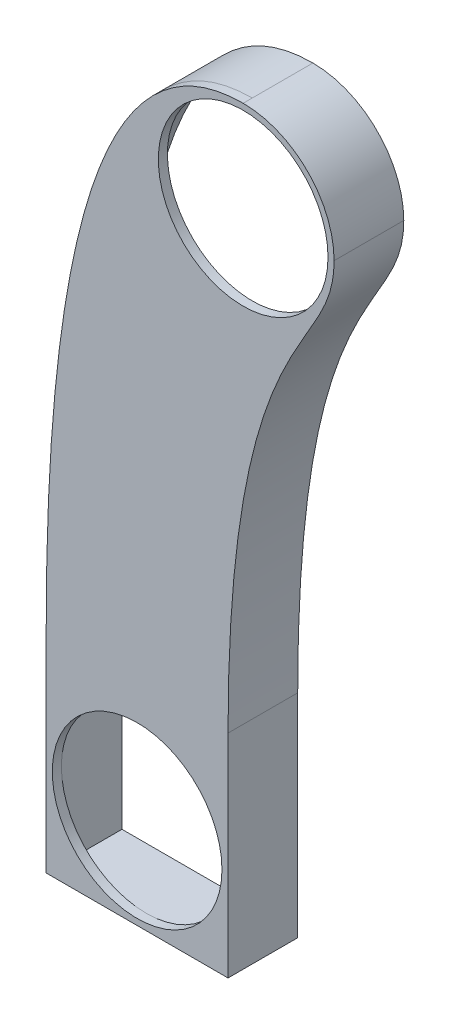
ISO-10303-21;
HEADER;
FILE_DESCRIPTION(('STEP AP214'),'2;1');
FILE_NAME('part.step','',(''),(''),'','','');
FILE_SCHEMA(('AUTOMOTIVE_DESIGN { 1 0 10303 214 1 1 1 1 }'));
ENDSEC;
DATA;
#1=APPLICATION_CONTEXT('core data for automotive mechanical design processes');
#2=APPLICATION_PROTOCOL_DEFINITION('international standard','automotive_design',2000,#1);
#3=PRODUCT_CONTEXT('',#1,'mechanical');
#4=PRODUCT('Part','Part','',(#3));
#5=PRODUCT_RELATED_PRODUCT_CATEGORY('part','',(#4));
#6=PRODUCT_DEFINITION_FORMATION('','',#4);
#7=PRODUCT_DEFINITION_CONTEXT('part definition',#1,'design');
#8=PRODUCT_DEFINITION('design','',#6,#7);
#9=PRODUCT_DEFINITION_SHAPE('','',#8);
#10=(LENGTH_UNIT() NAMED_UNIT(*) SI_UNIT(.MILLI.,.METRE.));
#11=(NAMED_UNIT(*) PLANE_ANGLE_UNIT() SI_UNIT($,.RADIAN.));
#12=(NAMED_UNIT(*) SI_UNIT($,.STERADIAN.) SOLID_ANGLE_UNIT());
#13=UNCERTAINTY_MEASURE_WITH_UNIT(LENGTH_MEASURE(1.E-05),#10,'distance_accuracy_value','');
#14=(GEOMETRIC_REPRESENTATION_CONTEXT(3) GLOBAL_UNCERTAINTY_ASSIGNED_CONTEXT((#13)) GLOBAL_UNIT_ASSIGNED_CONTEXT((#10,
#11,#12)) REPRESENTATION_CONTEXT('',''));
#15=CARTESIAN_POINT('',(0.,0.,0.));
#16=DIRECTION('',(0.,0.,1.));
#17=DIRECTION('',(1.,0.,0.));
#18=AXIS2_PLACEMENT_3D('',#15,#16,#17);
#19=CARTESIAN_POINT('',(0.,0.,0.));
#20=DIRECTION('',(0.,0.,1.));
#21=DIRECTION('',(1.,0.,0.));
#22=AXIS2_PLACEMENT_3D('',#19,#20,#21);
#23=PLANE('',#22);
#24=DIRECTION('',(-9.3542412378089E-13,1.,0.));
#25=VECTOR('',#24,1.);
#26=CARTESIAN_POINT('',(-28.,-68.,0.));
#27=LINE('',#26,#25);
#28=CARTESIAN_POINT('',(-28.0000000000262,-40.0000000000262,0.));
#29=VERTEX_POINT('',#28);
#30=CARTESIAN_POINT('',(-28.0000000000636,1.82354131794682E-11,0.));
#31=VERTEX_POINT('',#30);
#32=EDGE_CURVE('E11',#29,#31,#27,.T.);
#33=ORIENTED_EDGE('',*,*,#32,.T.);
#34=CARTESIAN_POINT('',(-28.0000000000636,1.82312256816691E-11,0.));
#35=CARTESIAN_POINT('',(-28.0000000000632,1.88242830589258,0.));
#36=CARTESIAN_POINT('',(-27.9894412004573,5.66891466084527,0.));
#37=CARTESIAN_POINT('',(-27.9260965546054,13.0686717703561,0.));
#38=CARTESIAN_POINT('',(-27.7677563903192,22.1131384556277,0.));
#39=CARTESIAN_POINT('',(-27.4511536703674,32.6004727744265,0.));
#40=CARTESIAN_POINT('',(-26.8603239944832,46.1086580240732,0.));
#41=CARTESIAN_POINT('',(-25.8056980342325,62.0968296216774,0.));
#42=CARTESIAN_POINT('',(-24.0353498943405,79.8475773779823,0.));
#43=CARTESIAN_POINT('',(-21.7615874898928,96.1606385496096,0.));
#44=CARTESIAN_POINT('',(-18.06159529243,115.99115876177,0.));
#45=CARTESIAN_POINT('',(-12.1907333738252,137.171036702095,0.));
#46=CARTESIAN_POINT('',(-3.19689664453314,156.784444581929,0.));
#47=CARTESIAN_POINT('',(5.83466156629296,168.281935436508,0.));
#48=CARTESIAN_POINT('',(13.9243973629886,174.636152769235,0.));
#49=CARTESIAN_POINT('',(19.3469360095935,177.454327422876,0.));
#50=CARTESIAN_POINT('',(23.9211292025,179.031545110437,0.));
#51=CARTESIAN_POINT('',(27.4748196463747,179.877405656582,0.));
#52=CARTESIAN_POINT('',(30.5465032109327,180.30151599736,0.));
#53=CARTESIAN_POINT('',(33.0654690458934,180.471580894841,0.));
#54=CARTESIAN_POINT('',(34.3577311572569,180.499999999884,0.));
#55=CARTESIAN_POINT('',(35.0000000000017,180.499999999884,0.));
#56=B_SPLINE_CURVE_WITH_KNOTS('',3,(#34,#35,#36,#37,#38,#39,#40,#41,#42,#43,#44,#45,#46,#47,#48,
#49,#50,#51,#52,#53,#54,#55),.UNSPECIFIED.,.F.,.F.,(4,1,1,1,1,1,1,1,1,1,1,1,1,1,1,1,1,1,1,4),
(0.493824089835039,0.49393282957438,0.49404156931372,0.494259048792402,0.494476528271083,
0.494694007749765,0.495128966707128,0.495563925664491,0.495998884621854,0.496433843579217,
0.497303761493944,0.49817367940867,0.499043597323396,0.499478556280759,0.499913515238122,
0.500130994716804,0.500348474195485,0.500565953674167,0.500674693413508,0.500783433152848),.UNSPECIFIED.);
#57=CARTESIAN_POINT('',(35.0000000000017,180.499999999942,0.));
#58=VERTEX_POINT('',#57);
#59=EDGE_CURVE('E293',#31,#58,#56,.T.);
#60=ORIENTED_EDGE('',*,*,#59,.T.);
#61=CARTESIAN_POINT('',(35.,152.5,0.));
#62=DIRECTION('',(0.,0.,1.));
#63=DIRECTION('',(1.,0.,0.));
#64=AXIS2_PLACEMENT_3D('',#61,#62,#63);
#65=CIRCLE('',#64,28.);
#66=CARTESIAN_POINT('',(62.9999999999418,152.5,0.));
#67=VERTEX_POINT('',#66);
#68=EDGE_CURVE('E166',#58,#67,#65,.T.);
#69=ORIENTED_EDGE('',*,*,#68,.T.);
#70=CARTESIAN_POINT('',(63.,152.5,0.));
#71=CARTESIAN_POINT('',(63.,152.069757812165,0.));
#72=CARTESIAN_POINT('',(62.9838250449428,151.199286284567,0.));
#73=CARTESIAN_POINT('',(62.8891848797862,149.54001987776,0.));
#74=CARTESIAN_POINT('',(62.65845259311,147.549741818048,0.));
#75=CARTESIAN_POINT('',(62.2138862986821,145.278400199613,0.));
#76=CARTESIAN_POINT('',(61.4108121463035,142.352354087116,0.));
#77=CARTESIAN_POINT('',(60.0332105680831,138.803653619855,0.));
#78=CARTESIAN_POINT('',(57.8462227018474,134.475175878977,0.));
#79=CARTESIAN_POINT('',(55.2089761951799,129.863823007502,0.));
#80=CARTESIAN_POINT('',(51.2314520335892,123.063969132701,0.));
#81=CARTESIAN_POINT('',(46.7924569058603,114.875371888974,0.));
#82=CARTESIAN_POINT('',(42.352360132025,104.461715313234,0.));
#83=CARTESIAN_POINT('',(39.1306324652729,95.3264090451642,0.));
#84=CARTESIAN_POINT('',(36.1230205341335,84.6512503590278,0.));
#85=CARTESIAN_POINT('',(33.4323495842207,72.2183690237835,0.));
#86=CARTESIAN_POINT('',(31.538773259296,60.2092444213663,0.));
#87=CARTESIAN_POINT('',(30.2835598019819,49.5017884718432,0.));
#88=CARTESIAN_POINT('',(29.484585221264,40.8932270784835,0.));
#89=CARTESIAN_POINT('',(28.8406681991326,31.6786860607649,0.));
#90=CARTESIAN_POINT('',(28.4438156030236,23.4718104333185,0.));
#91=CARTESIAN_POINT('',(28.2165076779976,16.5749660647671,0.));
#92=CARTESIAN_POINT('',(28.092697498186,11.2343839804093,0.));
#93=CARTESIAN_POINT('',(28.0297350777991,6.63685717797195,0.));
#94=CARTESIAN_POINT('',(28.0042856546149,2.8782378858248,0.));
#95=CARTESIAN_POINT('',(28.,0.95582289376821,0.));
#96=CARTESIAN_POINT('',(28.,0.,0.));
#97=B_SPLINE_CURVE_WITH_KNOTS('',3,(#70,#71,#72,#73,#74,#75,#76,#77,#78,#79,#80,#81,#82,#83,#84,
#85,#86,#87,#88,#89,#90,#91,#92,#93,#94,#95,#96),.UNSPECIFIED.,.F.,.F.,(4,1,1,1,1,1,1,1,1,1,1,1,
1,1,1,1,1,1,1,1,1,1,1,1,4),(0.,0.015625,0.03125,0.0625,0.09375,0.125,0.1875,0.25,0.3125,0.375,
0.5,0.5625,0.625,0.6875,0.75,0.8125,0.84375,0.875,0.90625,0.9375,0.953125,0.96875,0.984375,
0.9921875,1.),.UNSPECIFIED.);
#98=CARTESIAN_POINT('',(28.,0.,0.));
#99=VERTEX_POINT('',#98);
#100=EDGE_CURVE('E355',#67,#99,#97,.T.);
#101=ORIENTED_EDGE('',*,*,#100,.T.);
#102=DIRECTION('',(0.,-1.,0.));
#103=VECTOR('',#102,1.);
#104=CARTESIAN_POINT('',(28.,0.,0.));
#105=LINE('',#104,#103);
#106=CARTESIAN_POINT('',(28.,-40.,0.));
#107=VERTEX_POINT('',#106);
#108=EDGE_CURVE('E350',#99,#107,#105,.T.);
#109=ORIENTED_EDGE('',*,*,#108,.T.);
#110=CARTESIAN_POINT('',(0.,-40.,0.));
#111=DIRECTION('',(0.,0.,1.));
#112=DIRECTION('',(1.,0.,0.));
#113=AXIS2_PLACEMENT_3D('',#110,#111,#112);
#114=CIRCLE('',#113,28.);
#115=EDGE_CURVE('E296',#107,#29,#114,.T.);
#116=ORIENTED_EDGE('',*,*,#115,.T.);
#117=EDGE_LOOP('',(#33,#60,#69,#101,#109,#116));
#118=FACE_BOUND('',#117,.T.);
#119=ADVANCED_FACE('F41',(#118),#23,.F.);
#120=DIRECTION('',(-1.,0.,0.));
#121=VECTOR('',#120,1.);
#122=CARTESIAN_POINT('',(28.,-68.,0.));
#123=LINE('',#122,#121);
#124=CARTESIAN_POINT('',(0.,-68.,0.));
#125=VERTEX_POINT('',#124);
#126=CARTESIAN_POINT('',(-28.,-68.,0.));
#127=VERTEX_POINT('',#126);
#128=EDGE_CURVE('E302',#125,#127,#123,.T.);
#129=ORIENTED_EDGE('',*,*,#128,.T.);
#130=EDGE_CURVE('E53',#127,#29,#27,.T.);
#131=ORIENTED_EDGE('',*,*,#130,.T.);
#132=EDGE_CURVE('E301',#29,#125,#114,.T.);
#133=ORIENTED_EDGE('',*,*,#132,.T.);
#134=EDGE_LOOP('',(#129,#131,#133));
#135=FACE_BOUND('',#134,.T.);
#136=ADVANCED_FACE('F279',(#135),#23,.F.);
#137=CARTESIAN_POINT('',(30.,0.,3.));
#138=DIRECTION('',(-1.,0.,0.));
#139=DIRECTION('',(0.,0.,1.));
#140=AXIS2_PLACEMENT_3D('',#137,#138,#139);
#141=PLANE('',#140);
#142=DIRECTION('',(0.,0.,-1.));
#143=VECTOR('',#142,1.);
#144=CARTESIAN_POINT('',(30.,-70.,3.));
#145=LINE('',#144,#143);
#146=CARTESIAN_POINT('',(30.,-70.,3.));
#147=VERTEX_POINT('',#146);
#148=CARTESIAN_POINT('',(30.,-70.,-20.));
#149=VERTEX_POINT('',#148);
#150=EDGE_CURVE('E321',#147,#149,#145,.T.);
#151=ORIENTED_EDGE('',*,*,#150,.T.);
#152=DIRECTION('',(0.,-1.,0.));
#153=VECTOR('',#152,1.);
#154=CARTESIAN_POINT('',(30.,0.,-20.));
#155=LINE('',#154,#153);
#156=CARTESIAN_POINT('',(30.,0.,-20.));
#157=VERTEX_POINT('',#156);
#158=EDGE_CURVE('E220',#157,#149,#155,.T.);
#159=ORIENTED_EDGE('',*,*,#158,.F.);
#160=DIRECTION('',(0.,0.,-1.));
#161=VECTOR('',#160,1.);
#162=CARTESIAN_POINT('',(30.,0.,3.));
#163=LINE('',#162,#161);
#164=CARTESIAN_POINT('',(30.,0.,3.));
#165=VERTEX_POINT('',#164);
#166=EDGE_CURVE('E45',#165,#157,#163,.T.);
#167=ORIENTED_EDGE('',*,*,#166,.F.);
#168=DIRECTION('',(0.,1.,0.));
#169=VECTOR('',#168,1.);
#170=CARTESIAN_POINT('',(30.,0.,3.));
#171=LINE('',#170,#169);
#172=EDGE_CURVE('E244',#147,#165,#171,.T.);
#173=ORIENTED_EDGE('',*,*,#172,.F.);
#174=EDGE_LOOP('',(#151,#159,#167,#173));
#175=FACE_BOUND('',#174,.T.);
#176=ADVANCED_FACE('F233',(#175),#141,.F.);
#177=CARTESIAN_POINT('',(30.,0.,3.));
#178=CARTESIAN_POINT('',(30.,122.919601084502,3.));
#179=CARTESIAN_POINT('',(65.,122.919601084502,3.));
#180=CARTESIAN_POINT('',(65.,152.5,3.));
#181=B_SPLINE_CURVE_WITH_KNOTS('',3,(#177,#178,#179,#180),.UNSPECIFIED.,.F.,.F.,(4,4),(0.,1.),.UNSPECIFIED.);
#182=DIRECTION('',(0.,0.,-1.));
#183=VECTOR('',#182,1.);
#184=SURFACE_OF_LINEAR_EXTRUSION('',#181,#183);
#185=ORIENTED_EDGE('',*,*,#166,.T.);
#186=CARTESIAN_POINT('',(65.,152.499999282763,-20.));
#187=CARTESIAN_POINT('',(65.0000225093433,152.079571540982,-20.));
#188=CARTESIAN_POINT('',(64.9929314754865,151.659116795042,-20.));
#189=CARTESIAN_POINT('',(64.9638737544473,150.819083773418,-20.));
#190=CARTESIAN_POINT('',(64.9419197255293,150.399505056417,-20.));
#191=CARTESIAN_POINT('',(64.8825127436622,149.561762039167,-20.));
#192=CARTESIAN_POINT('',(64.8450718115272,149.143596894952,-20.));
#193=CARTESIAN_POINT('',(64.7542697192073,148.30922507543,-20.));
#194=CARTESIAN_POINT('',(64.700917243483,147.893017457263,-20.));
#195=CARTESIAN_POINT('',(64.5780655360384,147.063081092378,-20.));
#196=CARTESIAN_POINT('',(64.50856982526,146.649351825273,-20.));
#197=CARTESIAN_POINT('',(64.3558967379244,145.837893642723,-20.));
#198=CARTESIAN_POINT('',(64.2732183706114,145.440070727142,-20.));
#199=CARTESIAN_POINT('',(64.0930145742882,144.647794070053,-20.));
#200=CARTESIAN_POINT('',(63.9954887672314,144.253340414604,-20.));
#201=CARTESIAN_POINT('',(63.7861032242475,143.468216072196,-20.));
#202=CARTESIAN_POINT('',(63.6742418983351,143.077545810039,-20.));
#203=CARTESIAN_POINT('',(63.4369336598666,142.300331776913,-20.));
#204=CARTESIAN_POINT('',(63.3114857940528,141.91378829758,-20.));
#205=CARTESIAN_POINT('',(63.0479738390948,141.145111676085,-20.));
#206=CARTESIAN_POINT('',(62.9099118624578,140.762977807466,-20.));
#207=CARTESIAN_POINT('',(62.586961271828,139.909936343195,-20.));
#208=CARTESIAN_POINT('',(62.3988908678292,139.440233624961,-20.));
#209=CARTESIAN_POINT('',(62.0071174863187,138.507437216813,-20.));
#210=CARTESIAN_POINT('',(61.8034147444672,138.044343427393,-20.));
#211=CARTESIAN_POINT('',(61.3827111960998,137.124194165594,-20.));
#212=CARTESIAN_POINT('',(61.1657088330288,136.667139407647,-20.));
#213=CARTESIAN_POINT('',(60.7207866089472,135.758484874742,-20.));
#214=CARTESIAN_POINT('',(60.4928684450266,135.306884265405,-20.));
#215=CARTESIAN_POINT('',(60.0261554126538,134.404106291875,-20.));
#216=CARTESIAN_POINT('',(59.7872800341304,133.952970700409,-20.));
#217=CARTESIAN_POINT('',(59.3027463187309,133.054481129822,-20.));
#218=CARTESIAN_POINT('',(59.0570892886997,132.607126443514,-20.));
#219=CARTESIAN_POINT('',(58.5607831980561,131.715113596393,-20.));
#220=CARTESIAN_POINT('',(58.3101333794672,131.27045585859,-20.));
#221=CARTESIAN_POINT('',(57.8054433133086,130.382858107568,-20.));
#222=CARTESIAN_POINT('',(57.5514018575572,129.939918783149,-20.));
#223=CARTESIAN_POINT('',(56.9554274844714,128.905778521757,-20.));
#224=CARTESIAN_POINT('',(56.612769992388,128.31499624511,-20.));
#225=CARTESIAN_POINT('',(55.927124577463,127.133620849294,-20.));
#226=CARTESIAN_POINT('',(55.5841366529613,126.543027731093,-20.));
#227=CARTESIAN_POINT('',(54.9001055554189,125.360430308046,-20.));
#228=CARTESIAN_POINT('',(54.5590631231961,124.7684255734,-20.));
#229=CARTESIAN_POINT('',(53.8809830068435,123.582124796041,-20.));
#230=CARTESIAN_POINT('',(53.5439453081311,122.987828761683,-20.));
#231=CARTESIAN_POINT('',(52.8755640180871,121.796399641421,-20.));
#232=CARTESIAN_POINT('',(52.5442178622454,121.199267996715,-20.));
#233=CARTESIAN_POINT('',(51.888259389072,120.001312317796,-20.));
#234=CARTESIAN_POINT('',(51.5636470740787,119.4004882823,-20.));
#235=CARTESIAN_POINT('',(50.9222983619453,118.195180739976,-20.));
#236=CARTESIAN_POINT('',(50.605556668198,117.590700054375,-20.));
#237=CARTESIAN_POINT('',(49.9804016616337,116.377444716498,-20.));
#238=CARTESIAN_POINT('',(49.671988349109,115.768670064073,-20.));
#239=CARTESIAN_POINT('',(49.0641422232935,114.547047382416,-20.));
#240=CARTESIAN_POINT('',(48.764704794547,113.934201651718,-20.));
#241=CARTESIAN_POINT('',(48.1749700480183,112.704126330879,-20.));
#242=CARTESIAN_POINT('',(47.8846728183301,112.086896698556,-20.));
#243=CARTESIAN_POINT('',(47.0279333854737,110.228962383492,-20.));
#244=CARTESIAN_POINT('',(46.4755142464176,108.98175301984,-20.));
#245=CARTESIAN_POINT('',(45.4113570677909,106.477790994225,-20.));
#246=CARTESIAN_POINT('',(44.8994222950001,105.221121765054,-20.));
#247=CARTESIAN_POINT('',(43.9118828427142,102.692179971328,-20.));
#248=CARTESIAN_POINT('',(43.436314232688,101.419893331449,-20.));
#249=CARTESIAN_POINT('',(42.5203487146474,98.8614883195292,-20.));
#250=CARTESIAN_POINT('',(42.0799829087202,97.5753588308279,-20.));
#251=CARTESIAN_POINT('',(41.2329127133748,94.9911405071065,-20.));
#252=CARTESIAN_POINT('',(40.8262307880103,93.6930443224692,-20.));
#253=CARTESIAN_POINT('',(40.0448544878124,91.0868124590694,-20.));
#254=CARTESIAN_POINT('',(39.670170630771,89.7786736321002,-20.));
#255=CARTESIAN_POINT('',(38.951070885791,87.1543118015461,-20.));
#256=CARTESIAN_POINT('',(38.6066511686576,85.8380898432978,-20.));
#257=CARTESIAN_POINT('',(37.7068090980276,82.2423068024699,-20.));
#258=CARTESIAN_POINT('',(37.1793111552935,79.9557239527925,-20.));
#259=CARTESIAN_POINT('',(36.1996410903517,75.3680977313031,-20.));
#260=CARTESIAN_POINT('',(35.7474234211959,73.0670639837941,-20.));
#261=CARTESIAN_POINT('',(34.9097166972455,68.4528629982201,-20.));
#262=CARTESIAN_POINT('',(34.5242299310801,66.1396953468081,-20.));
#263=CARTESIAN_POINT('',(33.8127172013442,61.5034512485222,-20.));
#264=CARTESIAN_POINT('',(33.4867125527975,59.1803715537141,-20.));
#265=CARTESIAN_POINT('',(32.8879777870148,54.5263382714896,-20.));
#266=CARTESIAN_POINT('',(32.6152717251679,52.1953816095359,-20.));
#267=CARTESIAN_POINT('',(32.1178396165017,47.527503502892,-20.));
#268=CARTESIAN_POINT('',(31.8931316604186,45.1905801439625,-20.));
#269=CARTESIAN_POINT('',(31.4836763972852,40.4728081050565,-20.));
#270=CARTESIAN_POINT('',(31.299681931251,38.0918945320051,-20.));
#271=CARTESIAN_POINT('',(30.9724162064871,33.3275169308154,-20.));
#272=CARTESIAN_POINT('',(30.8291411525552,30.9440531611635,-20.));
#273=CARTESIAN_POINT('',(30.5796807651572,26.1765414778631,-20.));
#274=CARTESIAN_POINT('',(30.4734747016567,23.7924946392056,-20.));
#275=CARTESIAN_POINT('',(30.2949389519626,19.0257730131996,-20.));
#276=CARTESIAN_POINT('',(30.2225721553516,16.6430995984045,-20.));
#277=CARTESIAN_POINT('',(30.1088465053855,11.8810598405537,-20.));
#278=CARTESIAN_POINT('',(30.0674352955506,9.50169473841081,-20.));
#279=CARTESIAN_POINT('',(30.0266282824348,5.93519976200994,-20.));
#280=CARTESIAN_POINT('',(30.0165769304312,4.74818030057058,-20.));
#281=CARTESIAN_POINT('',(30.0032638306504,2.37410781116155,-20.));
#282=CARTESIAN_POINT('',(30.0000020556179,1.18705478334577,-20.));
#283=CARTESIAN_POINT('',(30.,0.,-20.));
#284=B_SPLINE_CURVE_WITH_KNOTS('',3,(#186,#187,#188,#189,#190,#191,#192,#193,#194,#195,#196,
#197,#198,#199,#200,#201,#202,#203,#204,#205,#206,#207,#208,#209,#210,#211,#212,#213,#214,#215,
#216,#217,#218,#219,#220,#221,#222,#223,#224,#225,#226,#227,#228,#229,#230,#231,#232,#233,#234,
#235,#236,#237,#238,#239,#240,#241,#242,#243,#244,#245,#246,#247,#248,#249,#250,#251,#252,#253,
#254,#255,#256,#257,#258,#259,#260,#261,#262,#263,#264,#265,#266,#267,#268,#269,#270,#271,#272,
#273,#274,#275,#276,#277,#278,#279,#280,#281,#282,#283),.UNSPECIFIED.,.F.,.F.,(4,2,2,2,2,2,2,2,
2,2,2,2,2,2,2,2,2,2,2,2,2,2,2,2,2,2,2,2,2,2,2,2,2,2,2,2,2,2,2,2,2,2,2,2,2,2,2,2,4),(0.,
1.26126273834924,2.52145265482902,3.78066625175537,5.03919382851775,6.29744716973587,
7.51612966488518,8.73484319539717,9.95369201338268,11.1726264036054,12.3913570296288,
13.9088851264048,15.426390350679,16.9440735204765,18.4615214957507,19.9928699891715,
21.5239254190813,23.0552150838164,24.5870656115527,26.6359502165881,28.684845169127,
30.7344742229997,32.7840958111544,34.8327682764232,36.8814414531025,38.9286964191062,
40.9759514569735,43.022135067628,45.0683383935318,49.1598763943493,53.2301232985655,
57.3043562444734,61.3821499278504,65.4626415873941,69.5444693865656,73.6257799832797,
80.6641393066473,87.6982245995224,94.732551088387,101.769393352181,108.809404274997,
115.852063950794,123.015715629643,130.17869941014,137.337671003809,144.488773067347,
151.627752634958,155.188922421417,158.750077912434),.UNSPECIFIED.);
#285=CARTESIAN_POINT('',(65.,152.499999282763,-20.));
#286=VERTEX_POINT('',#285);
#287=EDGE_CURVE('E210',#286,#157,#284,.T.);
#288=ORIENTED_EDGE('',*,*,#287,.F.);
#289=DIRECTION('',(0.,0.,-1.));
#290=VECTOR('',#289,1.);
#291=CARTESIAN_POINT('',(65.,152.5,3.));
#292=LINE('',#291,#290);
#293=CARTESIAN_POINT('',(65.,152.5,3.));
#294=VERTEX_POINT('',#293);
#295=EDGE_CURVE('E337',#294,#286,#292,.T.);
#296=ORIENTED_EDGE('',*,*,#295,.F.);
#297=EDGE_CURVE('E236',#165,#294,#181,.T.);
#298=ORIENTED_EDGE('',*,*,#297,.F.);
#299=EDGE_LOOP('',(#185,#288,#296,#298));
#300=FACE_BOUND('',#299,.T.);
#301=ADVANCED_FACE('F226',(#300),#184,.F.);
#302=CARTESIAN_POINT('',(35.,152.5,3.));
#303=DIRECTION('',(0.,0.,-1.));
#304=DIRECTION('',(-1.,0.,0.));
#305=AXIS2_PLACEMENT_3D('',#302,#303,#304);
#306=CYLINDRICAL_SURFACE('',#305,30.);
#307=ORIENTED_EDGE('',*,*,#295,.T.);
#308=CARTESIAN_POINT('',(35.,152.5,-20.));
#309=DIRECTION('',(0.,0.,-1.));
#310=DIRECTION('',(-1.,0.,0.));
#311=AXIS2_PLACEMENT_3D('',#308,#309,#310);
#312=CIRCLE('',#311,30.);
#313=CARTESIAN_POINT('',(35.,182.5,-20.));
#314=VERTEX_POINT('',#313);
#315=EDGE_CURVE('E221',#314,#286,#312,.T.);
#316=ORIENTED_EDGE('',*,*,#315,.F.);
#317=DIRECTION('',(0.,0.,1.));
#318=VECTOR('',#317,1.);
#319=CARTESIAN_POINT('',(35.,182.5,-20.));
#320=LINE('',#319,#318);
#321=CARTESIAN_POINT('',(35.,182.5,0.));
#322=VERTEX_POINT('',#321);
#323=EDGE_CURVE('E222',#314,#322,#320,.T.);
#324=ORIENTED_EDGE('',*,*,#323,.T.);
#325=DIRECTION('',(0.,0.,-1.));
#326=VECTOR('',#325,1.);
#327=CARTESIAN_POINT('',(35.,182.5,3.));
#328=LINE('',#327,#326);
#329=CARTESIAN_POINT('',(35.,182.5,3.));
#330=VERTEX_POINT('',#329);
#331=EDGE_CURVE('E334',#330,#322,#328,.T.);
#332=ORIENTED_EDGE('',*,*,#331,.F.);
#333=CARTESIAN_POINT('',(35.,152.5,3.));
#334=DIRECTION('',(0.,0.,1.));
#335=DIRECTION('',(1.,0.,0.));
#336=AXIS2_PLACEMENT_3D('',#333,#334,#335);
#337=CIRCLE('',#336,30.);
#338=EDGE_CURVE('E243',#330,#294,#337,.F.);
#339=ORIENTED_EDGE('',*,*,#338,.T.);
#340=EDGE_LOOP('',(#307,#316,#324,#332,#339));
#341=FACE_BOUND('',#340,.T.);
#342=ADVANCED_FACE('F232',(#341),#306,.T.);
#343=CARTESIAN_POINT('',(-30.,0.,3.));
#344=CARTESIAN_POINT('',(-30.,182.5,3.));
#345=CARTESIAN_POINT('',(35.,182.5,3.));
#346=B_SPLINE_CURVE_WITH_KNOTS('',2,(#343,#344,#345),.UNSPECIFIED.,.F.,.F.,(3,3),(0.,1.),.UNSPECIFIED.);
#347=DIRECTION('',(0.,0.,-1.));
#348=VECTOR('',#347,1.);
#349=SURFACE_OF_LINEAR_EXTRUSION('',#346,#348);
#350=CARTESIAN_POINT('',(-30.,0.,0.));
#351=CARTESIAN_POINT('',(-30.,182.5,0.));
#352=CARTESIAN_POINT('',(35.,182.5,0.));
#353=B_SPLINE_CURVE_WITH_KNOTS('',2,(#350,#351,#352),.UNSPECIFIED.,.F.,.F.,(3,3),(0.,1.),.UNSPECIFIED.);
#354=CARTESIAN_POINT('',(-30.,0.,0.));
#355=VERTEX_POINT('',#354);
#356=EDGE_CURVE('E313',#355,#322,#353,.T.);
#357=ORIENTED_EDGE('',*,*,#356,.F.);
#358=DIRECTION('',(0.,0.,-1.));
#359=VECTOR('',#358,1.);
#360=CARTESIAN_POINT('',(-30.,0.,3.));
#361=LINE('',#360,#359);
#362=CARTESIAN_POINT('',(-30.,0.,3.));
#363=VERTEX_POINT('',#362);
#364=EDGE_CURVE('E330',#363,#355,#361,.T.);
#365=ORIENTED_EDGE('',*,*,#364,.F.);
#366=EDGE_CURVE('E251',#363,#330,#346,.T.);
#367=ORIENTED_EDGE('',*,*,#366,.T.);
#368=ORIENTED_EDGE('',*,*,#331,.T.);
#369=EDGE_LOOP('',(#357,#365,#367,#368));
#370=FACE_BOUND('',#369,.T.);
#371=ADVANCED_FACE('F263',(#370),#349,.T.);
#372=CARTESIAN_POINT('',(-30.,0.,3.));
#373=DIRECTION('',(1.,0.,0.));
#374=DIRECTION('',(0.,0.,-1.));
#375=AXIS2_PLACEMENT_3D('',#372,#373,#374);
#376=PLANE('',#375);
#377=ORIENTED_EDGE('',*,*,#364,.T.);
#378=DIRECTION('',(0.,0.,1.));
#379=VECTOR('',#378,1.);
#380=CARTESIAN_POINT('',(-30.,0.,-20.));
#381=LINE('',#380,#379);
#382=CARTESIAN_POINT('',(-30.,0.,-20.));
#383=VERTEX_POINT('',#382);
#384=EDGE_CURVE('E418',#383,#355,#381,.T.);
#385=ORIENTED_EDGE('',*,*,#384,.F.);
#386=DIRECTION('',(0.,1.,0.));
#387=VECTOR('',#386,1.);
#388=CARTESIAN_POINT('',(-30.,-70.,-20.));
#389=LINE('',#388,#387);
#390=CARTESIAN_POINT('',(-30.,-70.,-20.));
#391=VERTEX_POINT('',#390);
#392=EDGE_CURVE('E416',#391,#383,#389,.T.);
#393=ORIENTED_EDGE('',*,*,#392,.F.);
#394=DIRECTION('',(0.,0.,-1.));
#395=VECTOR('',#394,1.);
#396=CARTESIAN_POINT('',(-30.,-70.,3.));
#397=LINE('',#396,#395);
#398=CARTESIAN_POINT('',(-30.,-70.,3.));
#399=VERTEX_POINT('',#398);
#400=EDGE_CURVE('E327',#399,#391,#397,.T.);
#401=ORIENTED_EDGE('',*,*,#400,.F.);
#402=DIRECTION('',(0.,-1.,0.));
#403=VECTOR('',#402,1.);
#404=CARTESIAN_POINT('',(-30.,0.,3.));
#405=LINE('',#404,#403);
#406=EDGE_CURVE('E258',#363,#399,#405,.T.);
#407=ORIENTED_EDGE('',*,*,#406,.F.);
#408=EDGE_LOOP('',(#377,#385,#393,#401,#407));
#409=FACE_BOUND('',#408,.T.);
#410=ADVANCED_FACE('F266',(#409),#376,.F.);
#411=CARTESIAN_POINT('',(0.,-40.,3.));
#412=DIRECTION('',(0.,0.,-1.));
#413=DIRECTION('',(-1.,0.,0.));
#414=AXIS2_PLACEMENT_3D('',#411,#412,#413);
#415=CYLINDRICAL_SURFACE('',#414,28.);
#416=CARTESIAN_POINT('',(0.,-40.,3.));
#417=DIRECTION('',(0.,0.,1.));
#418=DIRECTION('',(1.,0.,0.));
#419=AXIS2_PLACEMENT_3D('',#416,#417,#418);
#420=CIRCLE('',#419,28.);
#421=CARTESIAN_POINT('',(28.,-40.,3.));
#422=VERTEX_POINT('',#421);
#423=EDGE_CURVE('E441',#422,#422,#420,.T.);
#424=ORIENTED_EDGE('',*,*,#423,.T.);
#425=EDGE_LOOP('',(#424));
#426=FACE_BOUND('',#425,.T.);
#427=ORIENTED_EDGE('',*,*,#115,.F.);
#428=EDGE_CURVE('E308',#125,#107,#114,.T.);
#429=ORIENTED_EDGE('',*,*,#428,.F.);
#430=ORIENTED_EDGE('',*,*,#132,.F.);
#431=EDGE_LOOP('',(#427,#429,#430));
#432=FACE_BOUND('',#431,.T.);
#433=ADVANCED_FACE('F270',(#426,#432),#415,.F.);
#434=CARTESIAN_POINT('',(35.,152.5,3.));
#435=DIRECTION('',(0.,0.,-1.));
#436=DIRECTION('',(-1.,0.,0.));
#437=AXIS2_PLACEMENT_3D('',#434,#435,#436);
#438=CYLINDRICAL_SURFACE('',#437,28.);
#439=CARTESIAN_POINT('',(35.,152.5,3.));
#440=DIRECTION('',(0.,0.,1.));
#441=DIRECTION('',(1.,0.,0.));
#442=AXIS2_PLACEMENT_3D('',#439,#440,#441);
#443=CIRCLE('',#442,28.);
#444=CARTESIAN_POINT('',(63.,152.5,3.));
#445=VERTEX_POINT('',#444);
#446=EDGE_CURVE('E224',#445,#445,#443,.T.);
#447=ORIENTED_EDGE('',*,*,#446,.T.);
#448=EDGE_LOOP('',(#447));
#449=FACE_BOUND('',#448,.T.);
#450=ORIENTED_EDGE('',*,*,#68,.F.);
#451=DIRECTION('',(0.,0.,1.));
#452=VECTOR('',#451,1.);
#453=CARTESIAN_POINT('',(35.0000000000017,180.499999999942,-20.));
#454=LINE('',#453,#452);
#455=CARTESIAN_POINT('',(35.0000000000017,180.499999999942,-20.));
#456=VERTEX_POINT('',#455);
#457=EDGE_CURVE('E152',#456,#58,#454,.T.);
#458=ORIENTED_EDGE('',*,*,#457,.F.);
#459=CARTESIAN_POINT('',(35.,152.5,-20.));
#460=DIRECTION('',(0.,0.,-1.));
#461=DIRECTION('',(-1.,0.,0.));
#462=AXIS2_PLACEMENT_3D('',#459,#460,#461);
#463=CIRCLE('',#462,27.9999999999418);
#464=CARTESIAN_POINT('',(62.9999999999418,152.5,-20.));
#465=VERTEX_POINT('',#464);
#466=EDGE_CURVE('E160',#456,#465,#463,.T.);
#467=ORIENTED_EDGE('',*,*,#466,.T.);
#468=DIRECTION('',(0.,0.,1.));
#469=VECTOR('',#468,1.);
#470=CARTESIAN_POINT('',(62.9999999999418,152.5,-20.));
#471=LINE('',#470,#469);
#472=EDGE_CURVE('E169',#465,#67,#471,.T.);
#473=ORIENTED_EDGE('',*,*,#472,.T.);
#474=EDGE_LOOP('',(#450,#458,#467,#473));
#475=FACE_BOUND('',#474,.T.);
#476=ADVANCED_FACE('F43',(#449,#475),#438,.F.);
#477=CARTESIAN_POINT('',(0.,-70.,3.));
#478=DIRECTION('',(0.,1.,0.));
#479=DIRECTION('',(0.,0.,1.));
#480=AXIS2_PLACEMENT_3D('',#477,#478,#479);
#481=PLANE('',#480);
#482=ORIENTED_EDGE('',*,*,#400,.T.);
#483=DIRECTION('',(-1.,0.,0.));
#484=VECTOR('',#483,1.);
#485=CARTESIAN_POINT('',(30.,-70.,-20.));
#486=LINE('',#485,#484);
#487=EDGE_CURVE('E412',#149,#391,#486,.T.);
#488=ORIENTED_EDGE('',*,*,#487,.F.);
#489=ORIENTED_EDGE('',*,*,#150,.F.);
#490=DIRECTION('',(1.,0.,0.));
#491=VECTOR('',#490,1.);
#492=CARTESIAN_POINT('',(0.,-70.,3.));
#493=LINE('',#492,#491);
#494=EDGE_CURVE('E67',#399,#147,#493,.T.);
#495=ORIENTED_EDGE('',*,*,#494,.F.);
#496=EDGE_LOOP('',(#482,#488,#489,#495));
#497=FACE_BOUND('',#496,.T.);
#498=ADVANCED_FACE('F272',(#497),#481,.F.);
#499=CARTESIAN_POINT('',(0.,0.,3.));
#500=DIRECTION('',(0.,0.,1.));
#501=DIRECTION('',(1.,0.,0.));
#502=AXIS2_PLACEMENT_3D('',#499,#500,#501);
#503=PLANE('',#502);
#504=ORIENTED_EDGE('',*,*,#446,.F.);
#505=EDGE_LOOP('',(#504));
#506=FACE_BOUND('',#505,.T.);
#507=ORIENTED_EDGE('',*,*,#423,.F.);
#508=EDGE_LOOP('',(#507));
#509=FACE_BOUND('',#508,.T.);
#510=ORIENTED_EDGE('',*,*,#172,.T.);
#511=ORIENTED_EDGE('',*,*,#297,.T.);
#512=ORIENTED_EDGE('',*,*,#338,.F.);
#513=ORIENTED_EDGE('',*,*,#366,.F.);
#514=ORIENTED_EDGE('',*,*,#406,.T.);
#515=ORIENTED_EDGE('',*,*,#494,.T.);
#516=EDGE_LOOP('',(#510,#511,#512,#513,#514,#515));
#517=FACE_BOUND('',#516,.T.);
#518=ADVANCED_FACE('F275',(#506,#509,#517),#503,.T.);
#519=ORIENTED_EDGE('',*,*,#428,.T.);
#520=CARTESIAN_POINT('',(28.,-68.,0.));
#521=VERTEX_POINT('',#520);
#522=EDGE_CURVE('E51',#107,#521,#105,.T.);
#523=ORIENTED_EDGE('',*,*,#522,.T.);
#524=EDGE_CURVE('E304',#521,#125,#123,.T.);
#525=ORIENTED_EDGE('',*,*,#524,.T.);
#526=EDGE_LOOP('',(#519,#523,#525));
#527=FACE_BOUND('',#526,.T.);
#528=ADVANCED_FACE('F205',(#527),#23,.F.);
#529=CARTESIAN_POINT('',(21.1892508393561,180.187241758574,-20.));
#530=DIRECTION('',(0.,0.,1.));
#531=DIRECTION('',(1.,0.,0.));
#532=AXIS2_PLACEMENT_3D('',#529,#530,#531);
#533=PLANE('',#532);
#534=CARTESIAN_POINT('',(327251.440009491,-944805.409258413,-20.));
#535=CARTESIAN_POINT('',(-335497.597038948,942213.702593855,-20.));
#536=CARTESIAN_POINT('',(343828.511071763,-938901.246962262,-20.));
#537=B_SPLINE_CURVE_WITH_KNOTS('',2,(#534,#535,#536),.UNSPECIFIED.,.F.,.F.,(3,3),(0.,1.),.UNSPECIFIED.);
#538=EDGE_CURVE('E168',#383,#314,#537,.T.);
#539=ORIENTED_EDGE('',*,*,#538,.T.);
#540=ORIENTED_EDGE('',*,*,#315,.T.);
#541=ORIENTED_EDGE('',*,*,#287,.T.);
#542=ORIENTED_EDGE('',*,*,#158,.T.);
#543=ORIENTED_EDGE('',*,*,#487,.T.);
#544=ORIENTED_EDGE('',*,*,#392,.T.);
#545=EDGE_LOOP('',(#539,#540,#541,#542,#543,#544));
#546=FACE_BOUND('',#545,.T.);
#547=CARTESIAN_POINT('',(-28.0000000000636,1.82312256816691E-11,-20.));
#548=CARTESIAN_POINT('',(-28.0000000000632,1.88242830589258,-20.));
#549=CARTESIAN_POINT('',(-27.9894412004573,5.66891466084527,-20.));
#550=CARTESIAN_POINT('',(-27.9260965546054,13.0686717703561,-20.));
#551=CARTESIAN_POINT('',(-27.7677563903192,22.1131384556277,-20.));
#552=CARTESIAN_POINT('',(-27.4511536703674,32.6004727744265,-20.));
#553=CARTESIAN_POINT('',(-26.8603239944832,46.1086580240732,-20.));
#554=CARTESIAN_POINT('',(-25.8056980342325,62.0968296216774,-20.));
#555=CARTESIAN_POINT('',(-24.0353498943405,79.8475773779823,-20.));
#556=CARTESIAN_POINT('',(-21.7615874898928,96.1606385496096,-20.));
#557=CARTESIAN_POINT('',(-18.06159529243,115.99115876177,-20.));
#558=CARTESIAN_POINT('',(-12.1907333738252,137.171036702095,-20.));
#559=CARTESIAN_POINT('',(-3.19689664453314,156.784444581929,-20.));
#560=CARTESIAN_POINT('',(5.83466156629296,168.281935436508,-20.));
#561=CARTESIAN_POINT('',(13.9243973629886,174.636152769235,-20.));
#562=CARTESIAN_POINT('',(19.3469360095935,177.454327422876,-20.));
#563=CARTESIAN_POINT('',(23.9211292025,179.031545110437,-20.));
#564=CARTESIAN_POINT('',(27.4748196463747,179.877405656582,-20.));
#565=CARTESIAN_POINT('',(30.5465032109327,180.30151599736,-20.));
#566=CARTESIAN_POINT('',(33.0654690458934,180.471580894841,-20.));
#567=CARTESIAN_POINT('',(34.3577311572569,180.499999999884,-20.));
#568=CARTESIAN_POINT('',(35.0000000000017,180.499999999884,-20.));
#569=B_SPLINE_CURVE_WITH_KNOTS('',3,(#547,#548,#549,#550,#551,#552,#553,#554,#555,#556,#557,
#558,#559,#560,#561,#562,#563,#564,#565,#566,#567,#568),.UNSPECIFIED.,.F.,.F.,(4,1,1,1,1,1,1,1,
1,1,1,1,1,1,1,1,1,1,1,4),(0.493824089835039,0.49393282957438,0.49404156931372,0.494259048792402,
0.494476528271083,0.494694007749765,0.495128966707128,0.495563925664491,0.495998884621854,
0.496433843579217,0.497303761493944,0.49817367940867,0.499043597323396,0.499478556280759,
0.499913515238122,0.500130994716804,0.500348474195485,0.500565953674167,0.500674693413508,
0.500783433152848),.UNSPECIFIED.);
#570=CARTESIAN_POINT('',(-28.0000000000636,1.82312256816691E-11,-20.));
#571=VERTEX_POINT('',#570);
#572=EDGE_CURVE('E149',#571,#456,#569,.T.);
#573=ORIENTED_EDGE('',*,*,#572,.F.);
#574=DIRECTION('',(-9.3542412378089E-13,1.,0.));
#575=VECTOR('',#574,1.);
#576=CARTESIAN_POINT('',(-28.,-68.,-20.));
#577=LINE('',#576,#575);
#578=CARTESIAN_POINT('',(-28.,-68.,-20.));
#579=VERTEX_POINT('',#578);
#580=EDGE_CURVE('E370',#579,#571,#577,.T.);
#581=ORIENTED_EDGE('',*,*,#580,.F.);
#582=DIRECTION('',(-1.,0.,0.));
#583=VECTOR('',#582,1.);
#584=CARTESIAN_POINT('',(28.,-68.,-20.));
#585=LINE('',#584,#583);
#586=CARTESIAN_POINT('',(28.,-68.,-20.));
#587=VERTEX_POINT('',#586);
#588=EDGE_CURVE('E375',#587,#579,#585,.T.);
#589=ORIENTED_EDGE('',*,*,#588,.F.);
#590=DIRECTION('',(0.,-1.,0.));
#591=VECTOR('',#590,1.);
#592=CARTESIAN_POINT('',(28.,0.,-20.));
#593=LINE('',#592,#591);
#594=CARTESIAN_POINT('',(28.,0.,-20.));
#595=VERTEX_POINT('',#594);
#596=EDGE_CURVE('E178',#595,#587,#593,.T.);
#597=ORIENTED_EDGE('',*,*,#596,.F.);
#598=CARTESIAN_POINT('',(63.,152.5,-20.));
#599=CARTESIAN_POINT('',(63.,152.069757812165,-20.));
#600=CARTESIAN_POINT('',(62.9838250449428,151.199286284567,-20.));
#601=CARTESIAN_POINT('',(62.8891848797862,149.54001987776,-20.));
#602=CARTESIAN_POINT('',(62.65845259311,147.549741818048,-20.));
#603=CARTESIAN_POINT('',(62.2138862986821,145.278400199613,-20.));
#604=CARTESIAN_POINT('',(61.4108121463035,142.352354087116,-20.));
#605=CARTESIAN_POINT('',(60.0332105680831,138.803653619855,-20.));
#606=CARTESIAN_POINT('',(57.8462227018474,134.475175878977,-20.));
#607=CARTESIAN_POINT('',(55.2089761951799,129.863823007502,-20.));
#608=CARTESIAN_POINT('',(51.2314520335892,123.063969132701,-20.));
#609=CARTESIAN_POINT('',(46.7924569058603,114.875371888974,-20.));
#610=CARTESIAN_POINT('',(42.352360132025,104.461715313234,-20.));
#611=CARTESIAN_POINT('',(39.1306324652729,95.3264090451642,-20.));
#612=CARTESIAN_POINT('',(36.1230205341335,84.6512503590278,-20.));
#613=CARTESIAN_POINT('',(33.4323495842207,72.2183690237835,-20.));
#614=CARTESIAN_POINT('',(31.538773259296,60.2092444213663,-20.));
#615=CARTESIAN_POINT('',(30.2835598019819,49.5017884718432,-20.));
#616=CARTESIAN_POINT('',(29.484585221264,40.8932270784835,-20.));
#617=CARTESIAN_POINT('',(28.8406681991326,31.6786860607649,-20.));
#618=CARTESIAN_POINT('',(28.4438156030236,23.4718104333185,-20.));
#619=CARTESIAN_POINT('',(28.2165076779976,16.5749660647671,-20.));
#620=CARTESIAN_POINT('',(28.092697498186,11.2343839804093,-20.));
#621=CARTESIAN_POINT('',(28.0297350777991,6.63685717797195,-20.));
#622=CARTESIAN_POINT('',(28.0042856546149,2.8782378858248,-20.));
#623=CARTESIAN_POINT('',(28.,0.95582289376821,-20.));
#624=CARTESIAN_POINT('',(28.,0.,-20.));
#625=B_SPLINE_CURVE_WITH_KNOTS('',3,(#598,#599,#600,#601,#602,#603,#604,#605,#606,#607,#608,
#609,#610,#611,#612,#613,#614,#615,#616,#617,#618,#619,#620,#621,#622,#623,#624),.UNSPECIFIED.,
.F.,.F.,(4,1,1,1,1,1,1,1,1,1,1,1,1,1,1,1,1,1,1,1,1,1,1,1,4),(0.,0.015625,0.03125,0.0625,0.09375,
0.125,0.1875,0.25,0.3125,0.375,0.5,0.5625,0.625,0.6875,0.75,0.8125,0.84375,0.875,0.90625,0.9375,
0.953125,0.96875,0.984375,0.9921875,1.),.UNSPECIFIED.);
#626=EDGE_CURVE('E174',#465,#595,#625,.T.);
#627=ORIENTED_EDGE('',*,*,#626,.F.);
#628=ORIENTED_EDGE('',*,*,#466,.F.);
#629=EDGE_LOOP('',(#573,#581,#589,#597,#627,#628));
#630=FACE_BOUND('',#629,.T.);
#631=ADVANCED_FACE('F172',(#546,#630),#533,.F.);
#632=DIRECTION('',(0.,0.,1.));
#633=VECTOR('',#632,1.);
#634=SURFACE_OF_LINEAR_EXTRUSION('',#537,#633);
#635=ORIENTED_EDGE('',*,*,#356,.T.);
#636=ORIENTED_EDGE('',*,*,#323,.F.);
#637=ORIENTED_EDGE('',*,*,#538,.F.);
#638=ORIENTED_EDGE('',*,*,#384,.T.);
#639=EDGE_LOOP('',(#635,#636,#637,#638));
#640=FACE_BOUND('',#639,.T.);
#641=ADVANCED_FACE('F201',(#640),#634,.F.);
#642=DIRECTION('',(0.,0.,1.));
#643=VECTOR('',#642,1.);
#644=SURFACE_OF_LINEAR_EXTRUSION('',#569,#643);
#645=ORIENTED_EDGE('',*,*,#59,.F.);
#646=DIRECTION('',(0.,0.,1.));
#647=VECTOR('',#646,1.);
#648=CARTESIAN_POINT('',(-28.0000000000636,1.82312256816691E-11,-20.));
#649=LINE('',#648,#647);
#650=EDGE_CURVE('E155',#571,#31,#649,.T.);
#651=ORIENTED_EDGE('',*,*,#650,.F.);
#652=ORIENTED_EDGE('',*,*,#572,.T.);
#653=ORIENTED_EDGE('',*,*,#457,.T.);
#654=EDGE_LOOP('',(#645,#651,#652,#653));
#655=FACE_BOUND('',#654,.T.);
#656=ADVANCED_FACE('F151',(#655),#644,.T.);
#657=DIRECTION('',(0.,0.,1.));
#658=VECTOR('',#657,1.);
#659=SURFACE_OF_LINEAR_EXTRUSION('',#625,#658);
#660=ORIENTED_EDGE('',*,*,#100,.F.);
#661=ORIENTED_EDGE('',*,*,#472,.F.);
#662=ORIENTED_EDGE('',*,*,#626,.T.);
#663=DIRECTION('',(0.,0.,1.));
#664=VECTOR('',#663,1.);
#665=CARTESIAN_POINT('',(28.,0.,-20.));
#666=LINE('',#665,#664);
#667=EDGE_CURVE('E385',#595,#99,#666,.T.);
#668=ORIENTED_EDGE('',*,*,#667,.T.);
#669=EDGE_LOOP('',(#660,#661,#662,#668));
#670=FACE_BOUND('',#669,.T.);
#671=ADVANCED_FACE('F192',(#670),#659,.T.);
#672=CARTESIAN_POINT('',(28.,0.,-20.));
#673=DIRECTION('',(-1.,0.,0.));
#674=DIRECTION('',(0.,0.,1.));
#675=AXIS2_PLACEMENT_3D('',#672,#673,#674);
#676=PLANE('',#675);
#677=ORIENTED_EDGE('',*,*,#108,.F.);
#678=ORIENTED_EDGE('',*,*,#667,.F.);
#679=ORIENTED_EDGE('',*,*,#596,.T.);
#680=DIRECTION('',(0.,0.,1.));
#681=VECTOR('',#680,1.);
#682=CARTESIAN_POINT('',(28.,-68.,-20.));
#683=LINE('',#682,#681);
#684=EDGE_CURVE('E384',#587,#521,#683,.T.);
#685=ORIENTED_EDGE('',*,*,#684,.T.);
#686=ORIENTED_EDGE('',*,*,#522,.F.);
#687=EDGE_LOOP('',(#677,#678,#679,#685,#686));
#688=FACE_BOUND('',#687,.T.);
#689=ADVANCED_FACE('F196',(#688),#676,.T.);
#690=CARTESIAN_POINT('',(28.,-68.,-20.));
#691=DIRECTION('',(0.,1.,0.));
#692=DIRECTION('',(0.,0.,1.));
#693=AXIS2_PLACEMENT_3D('',#690,#691,#692);
#694=PLANE('',#693);
#695=ORIENTED_EDGE('',*,*,#524,.F.);
#696=ORIENTED_EDGE('',*,*,#684,.F.);
#697=ORIENTED_EDGE('',*,*,#588,.T.);
#698=DIRECTION('',(0.,0.,1.));
#699=VECTOR('',#698,1.);
#700=CARTESIAN_POINT('',(-28.,-68.,-20.));
#701=LINE('',#700,#699);
#702=EDGE_CURVE('E388',#579,#127,#701,.T.);
#703=ORIENTED_EDGE('',*,*,#702,.T.);
#704=ORIENTED_EDGE('',*,*,#128,.F.);
#705=EDGE_LOOP('',(#695,#696,#697,#703,#704));
#706=FACE_BOUND('',#705,.T.);
#707=ADVANCED_FACE('F386',(#706),#694,.T.);
#708=CARTESIAN_POINT('',(-28.,-68.,-20.));
#709=DIRECTION('',(1.,9.3542412378089E-13,0.));
#710=DIRECTION('',(-9.3542412378089E-13,1.,0.));
#711=AXIS2_PLACEMENT_3D('',#708,#709,#710);
#712=PLANE('',#711);
#713=ORIENTED_EDGE('',*,*,#130,.F.);
#714=ORIENTED_EDGE('',*,*,#702,.F.);
#715=ORIENTED_EDGE('',*,*,#580,.T.);
#716=ORIENTED_EDGE('',*,*,#650,.T.);
#717=ORIENTED_EDGE('',*,*,#32,.F.);
#718=EDGE_LOOP('',(#713,#714,#715,#716,#717));
#719=FACE_BOUND('',#718,.T.);
#720=ADVANCED_FACE('F297',(#719),#712,.T.);
#721=CLOSED_SHELL('',(#119,#136,#176,#301,#342,#371,#410,#433,#476,#498,#518,#528,#631,#641,
#656,#671,#689,#707,#720));
#722=MANIFOLD_SOLID_BREP('B2',#721);
#723=ADVANCED_BREP_SHAPE_REPRESENTATION('',(#18,#722),#14);
#724=SHAPE_DEFINITION_REPRESENTATION(#9,#723);
ENDSEC;
END-ISO-10303-21;
